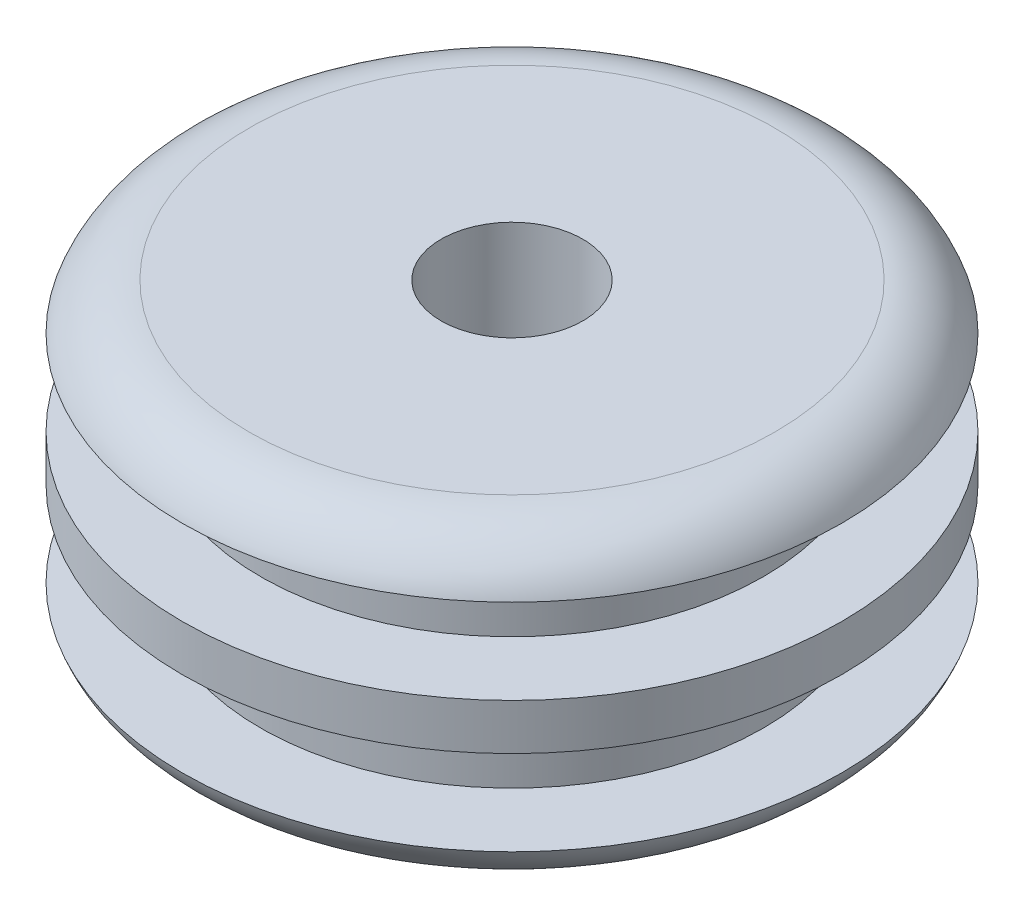
ISO-10303-21;
HEADER;
FILE_DESCRIPTION(('STEP AP214'),'2;1');
FILE_NAME('part.step','',(''),(''),'','','');
FILE_SCHEMA(('AUTOMOTIVE_DESIGN { 1 0 10303 214 1 1 1 1 }'));
ENDSEC;
DATA;
#1=APPLICATION_CONTEXT('core data for automotive mechanical design processes');
#2=APPLICATION_PROTOCOL_DEFINITION('international standard','automotive_design',2000,#1);
#3=PRODUCT_CONTEXT('',#1,'mechanical');
#4=PRODUCT('Part','Part','',(#3));
#5=PRODUCT_RELATED_PRODUCT_CATEGORY('part','',(#4));
#6=PRODUCT_DEFINITION_FORMATION('','',#4);
#7=PRODUCT_DEFINITION_CONTEXT('part definition',#1,'design');
#8=PRODUCT_DEFINITION('design','',#6,#7);
#9=PRODUCT_DEFINITION_SHAPE('','',#8);
#10=(LENGTH_UNIT() NAMED_UNIT(*) SI_UNIT(.MILLI.,.METRE.));
#11=(NAMED_UNIT(*) PLANE_ANGLE_UNIT() SI_UNIT($,.RADIAN.));
#12=(NAMED_UNIT(*) SI_UNIT($,.STERADIAN.) SOLID_ANGLE_UNIT());
#13=UNCERTAINTY_MEASURE_WITH_UNIT(LENGTH_MEASURE(1.E-05),#10,'distance_accuracy_value','');
#14=(GEOMETRIC_REPRESENTATION_CONTEXT(3) GLOBAL_UNCERTAINTY_ASSIGNED_CONTEXT((#13)) GLOBAL_UNIT_ASSIGNED_CONTEXT((#10,
#11,#12)) REPRESENTATION_CONTEXT('',''));
#15=CARTESIAN_POINT('',(0.,0.,0.));
#16=DIRECTION('',(0.,0.,1.));
#17=DIRECTION('',(1.,0.,0.));
#18=AXIS2_PLACEMENT_3D('',#15,#16,#17);
#19=CARTESIAN_POINT('',(0.,-1.85,0.));
#20=DIRECTION('',(0.,-1.,0.));
#21=DIRECTION('',(0.,0.,-1.));
#22=AXIS2_PLACEMENT_3D('',#19,#20,#21);
#23=PLANE('',#22);
#24=CARTESIAN_POINT('',(0.,-1.85,0.));
#25=DIRECTION('',(0.,-1.,0.));
#26=DIRECTION('',(0.,0.,-1.));
#27=AXIS2_PLACEMENT_3D('',#24,#25,#26);
#28=CIRCLE('',#27,1.);
#29=CARTESIAN_POINT('',(0.,-1.85,-1.));
#30=VERTEX_POINT('',#29);
#31=EDGE_CURVE('E152',#30,#30,#28,.T.);
#32=ORIENTED_EDGE('',*,*,#31,.F.);
#33=EDGE_LOOP('',(#32));
#34=FACE_BOUND('',#33,.T.);
#35=CARTESIAN_POINT('',(0.,-1.85,0.));
#36=DIRECTION('',(0.,-1.,0.));
#37=DIRECTION('',(0.,0.,-1.));
#38=AXIS2_PLACEMENT_3D('',#35,#36,#37);
#39=CIRCLE('',#38,1.85);
#40=CARTESIAN_POINT('',(0.,-1.85,-1.85));
#41=VERTEX_POINT('',#40);
#42=EDGE_CURVE('E180',#41,#41,#39,.T.);
#43=ORIENTED_EDGE('',*,*,#42,.T.);
#44=EDGE_LOOP('',(#43));
#45=FACE_BOUND('',#44,.T.);
#46=ADVANCED_FACE('F37',(#34,#45),#23,.T.);
#47=CARTESIAN_POINT('',(0.,2.5,0.));
#48=DIRECTION('',(0.,1.,0.));
#49=DIRECTION('',(0.,0.,1.));
#50=AXIS2_PLACEMENT_3D('',#47,#48,#49);
#51=PLANE('',#50);
#52=CARTESIAN_POINT('',(0.,2.5,0.));
#53=DIRECTION('',(0.,1.,0.));
#54=DIRECTION('',(0.,0.,1.));
#55=AXIS2_PLACEMENT_3D('',#52,#53,#54);
#56=CIRCLE('',#55,3.71325030024024);
#57=CARTESIAN_POINT('',(0.,2.5,3.71325030024024));
#58=VERTEX_POINT('',#57);
#59=EDGE_CURVE('E11',#58,#58,#56,.T.);
#60=ORIENTED_EDGE('',*,*,#59,.T.);
#61=EDGE_LOOP('',(#60));
#62=FACE_BOUND('',#61,.T.);
#63=CARTESIAN_POINT('',(0.,2.5,0.));
#64=DIRECTION('',(0.,1.,0.));
#65=DIRECTION('',(0.,0.,1.));
#66=AXIS2_PLACEMENT_3D('',#63,#64,#65);
#67=CIRCLE('',#66,1.);
#68=CARTESIAN_POINT('',(0.,2.5,1.));
#69=VERTEX_POINT('',#68);
#70=EDGE_CURVE('E56',#69,#69,#67,.T.);
#71=ORIENTED_EDGE('',*,*,#70,.F.);
#72=EDGE_LOOP('',(#71));
#73=FACE_BOUND('',#72,.T.);
#74=ADVANCED_FACE('F132',(#62,#73),#51,.T.);
#75=CARTESIAN_POINT('',(0.,0.,0.));
#76=DIRECTION('',(0.,1.,0.));
#77=DIRECTION('',(0.,0.,1.));
#78=AXIS2_PLACEMENT_3D('',#75,#76,#77);
#79=CYLINDRICAL_SURFACE('',#78,1.);
#80=ORIENTED_EDGE('',*,*,#70,.T.);
#81=EDGE_LOOP('',(#80));
#82=FACE_BOUND('',#81,.T.);
#83=ORIENTED_EDGE('',*,*,#31,.T.);
#84=EDGE_LOOP('',(#83));
#85=FACE_BOUND('',#84,.T.);
#86=ADVANCED_FACE('F128',(#82,#85),#79,.F.);
#87=CARTESIAN_POINT('',(-5.75,0.,0.));
#88=DIRECTION('',(0.,-1.,0.));
#89=DIRECTION('',(1.,0.,0.));
#90=AXIS2_PLACEMENT_3D('',#87,#88,#89);
#91=PLANE('',#90);
#92=CARTESIAN_POINT('',(0.,0.,0.));
#93=DIRECTION('',(0.,-1.,0.));
#94=DIRECTION('',(1.,0.,0.));
#95=AXIS2_PLACEMENT_3D('',#92,#93,#94);
#96=CIRCLE('',#95,3.55);
#97=CARTESIAN_POINT('',(3.55,0.,0.));
#98=VERTEX_POINT('',#97);
#99=EDGE_CURVE('E169',#98,#98,#96,.T.);
#100=ORIENTED_EDGE('',*,*,#99,.F.);
#101=EDGE_LOOP('',(#100));
#102=FACE_BOUND('',#101,.T.);
#103=CARTESIAN_POINT('',(0.,0.,0.));
#104=DIRECTION('',(0.,-1.,0.));
#105=DIRECTION('',(1.,0.,0.));
#106=AXIS2_PLACEMENT_3D('',#103,#104,#105);
#107=CIRCLE('',#106,4.65);
#108=CARTESIAN_POINT('',(4.65,0.,0.));
#109=VERTEX_POINT('',#108);
#110=EDGE_CURVE('E157',#109,#109,#107,.T.);
#111=ORIENTED_EDGE('',*,*,#110,.T.);
#112=EDGE_LOOP('',(#111));
#113=FACE_BOUND('',#112,.T.);
#114=ADVANCED_FACE('F121',(#102,#113),#91,.T.);
#115=CARTESIAN_POINT('',(-5.75,-1.2,0.));
#116=DIRECTION('',(0.,1.,0.));
#117=DIRECTION('',(-1.,0.,0.));
#118=AXIS2_PLACEMENT_3D('',#115,#116,#117);
#119=PLANE('',#118);
#120=CARTESIAN_POINT('',(0.,-1.2,0.));
#121=DIRECTION('',(0.,-1.,0.));
#122=DIRECTION('',(1.,0.,0.));
#123=AXIS2_PLACEMENT_3D('',#120,#121,#122);
#124=CIRCLE('',#123,3.55);
#125=CARTESIAN_POINT('',(3.55,-1.2,0.));
#126=VERTEX_POINT('',#125);
#127=EDGE_CURVE('E173',#126,#126,#124,.T.);
#128=ORIENTED_EDGE('',*,*,#127,.T.);
#129=EDGE_LOOP('',(#128));
#130=FACE_BOUND('',#129,.T.);
#131=CARTESIAN_POINT('',(0.,-1.2,0.));
#132=DIRECTION('',(0.,1.,0.));
#133=DIRECTION('',(-1.,0.,0.));
#134=AXIS2_PLACEMENT_3D('',#131,#132,#133);
#135=CIRCLE('',#134,4.65);
#136=CARTESIAN_POINT('',(-4.65,-1.2,0.));
#137=VERTEX_POINT('',#136);
#138=EDGE_CURVE('E161',#137,#137,#135,.T.);
#139=ORIENTED_EDGE('',*,*,#138,.T.);
#140=EDGE_LOOP('',(#139));
#141=FACE_BOUND('',#140,.T.);
#142=ADVANCED_FACE('F117',(#130,#141),#119,.T.);
#143=CARTESIAN_POINT('',(0.,0.,0.));
#144=DIRECTION('',(0.,-1.,0.));
#145=DIRECTION('',(1.,0.,0.));
#146=AXIS2_PLACEMENT_3D('',#143,#144,#145);
#147=CYLINDRICAL_SURFACE('',#146,3.55);
#148=ORIENTED_EDGE('',*,*,#99,.T.);
#149=EDGE_LOOP('',(#148));
#150=FACE_BOUND('',#149,.T.);
#151=ORIENTED_EDGE('',*,*,#127,.F.);
#152=EDGE_LOOP('',(#151));
#153=FACE_BOUND('',#152,.T.);
#154=ADVANCED_FACE('F120',(#150,#153),#147,.T.);
#155=CARTESIAN_POINT('',(0.,2.5,0.));
#156=DIRECTION('',(0.,-1.,0.));
#157=DIRECTION('',(0.,0.,-1.));
#158=AXIS2_PLACEMENT_3D('',#155,#156,#157);
#159=CYLINDRICAL_SURFACE('',#158,4.65);
#160=ORIENTED_EDGE('',*,*,#110,.F.);
#161=EDGE_LOOP('',(#160));
#162=FACE_BOUND('',#161,.T.);
#163=CARTESIAN_POINT('',(0.,0.65,0.));
#164=DIRECTION('',(0.,1.,0.));
#165=DIRECTION('',(-1.,0.,0.));
#166=AXIS2_PLACEMENT_3D('',#163,#164,#165);
#167=CIRCLE('',#166,4.65);
#168=CARTESIAN_POINT('',(-4.65,0.649999999999999,0.));
#169=VERTEX_POINT('',#168);
#170=EDGE_CURVE('E153',#169,#169,#167,.T.);
#171=ORIENTED_EDGE('',*,*,#170,.F.);
#172=EDGE_LOOP('',(#171));
#173=FACE_BOUND('',#172,.T.);
#174=ADVANCED_FACE('F111',(#162,#173),#159,.T.);
#175=CARTESIAN_POINT('',(-5.75,1.85,0.));
#176=DIRECTION('',(0.,-1.,0.));
#177=DIRECTION('',(1.,0.,0.));
#178=AXIS2_PLACEMENT_3D('',#175,#176,#177);
#179=PLANE('',#178);
#180=CARTESIAN_POINT('',(0.,1.85,0.));
#181=DIRECTION('',(0.,-1.,0.));
#182=DIRECTION('',(1.,0.,0.));
#183=AXIS2_PLACEMENT_3D('',#180,#181,#182);
#184=CIRCLE('',#183,3.55);
#185=CARTESIAN_POINT('',(3.55,1.85,0.));
#186=VERTEX_POINT('',#185);
#187=EDGE_CURVE('E166',#186,#186,#184,.T.);
#188=ORIENTED_EDGE('',*,*,#187,.F.);
#189=EDGE_LOOP('',(#188));
#190=FACE_BOUND('',#189,.T.);
#191=CARTESIAN_POINT('',(0.,1.85,0.));
#192=DIRECTION('',(0.,-1.,0.));
#193=DIRECTION('',(1.,0.,0.));
#194=AXIS2_PLACEMENT_3D('',#191,#192,#193);
#195=CIRCLE('',#194,4.65);
#196=CARTESIAN_POINT('',(4.65,1.85,0.));
#197=VERTEX_POINT('',#196);
#198=EDGE_CURVE('E59',#197,#197,#195,.T.);
#199=ORIENTED_EDGE('',*,*,#198,.T.);
#200=EDGE_LOOP('',(#199));
#201=FACE_BOUND('',#200,.T.);
#202=ADVANCED_FACE('F107',(#190,#201),#179,.T.);
#203=CARTESIAN_POINT('',(-5.75,0.649999999999999,0.));
#204=DIRECTION('',(0.,1.,0.));
#205=DIRECTION('',(-1.,0.,0.));
#206=AXIS2_PLACEMENT_3D('',#203,#204,#205);
#207=PLANE('',#206);
#208=CARTESIAN_POINT('',(0.,0.65,0.));
#209=DIRECTION('',(0.,-1.,0.));
#210=DIRECTION('',(1.,0.,0.));
#211=AXIS2_PLACEMENT_3D('',#208,#209,#210);
#212=CIRCLE('',#211,3.55);
#213=CARTESIAN_POINT('',(3.55,0.65,0.));
#214=VERTEX_POINT('',#213);
#215=EDGE_CURVE('E172',#214,#214,#212,.T.);
#216=ORIENTED_EDGE('',*,*,#215,.T.);
#217=EDGE_LOOP('',(#216));
#218=FACE_BOUND('',#217,.T.);
#219=ORIENTED_EDGE('',*,*,#170,.T.);
#220=EDGE_LOOP('',(#219));
#221=FACE_BOUND('',#220,.T.);
#222=ADVANCED_FACE('F103',(#218,#221),#207,.T.);
#223=CARTESIAN_POINT('',(0.,0.,0.));
#224=DIRECTION('',(0.,-1.,0.));
#225=DIRECTION('',(1.,0.,0.));
#226=AXIS2_PLACEMENT_3D('',#223,#224,#225);
#227=CYLINDRICAL_SURFACE('',#226,3.55);
#228=ORIENTED_EDGE('',*,*,#187,.T.);
#229=EDGE_LOOP('',(#228));
#230=FACE_BOUND('',#229,.T.);
#231=ORIENTED_EDGE('',*,*,#215,.F.);
#232=EDGE_LOOP('',(#231));
#233=FACE_BOUND('',#232,.T.);
#234=ADVANCED_FACE('F106',(#230,#233),#227,.T.);
#235=CARTESIAN_POINT('',(0.,-0.85,0.));
#236=DIRECTION('',(0.,1.,0.));
#237=DIRECTION('',(0.,0.,1.));
#238=AXIS2_PLACEMENT_3D('',#235,#236,#237);
#239=TOROIDAL_SURFACE('',#238,3.71325030024024,1.);
#240=ORIENTED_EDGE('',*,*,#138,.F.);
#241=EDGE_LOOP('',(#240));
#242=FACE_BOUND('',#241,.T.);
#243=CARTESIAN_POINT('',(0.,-1.8499999999999,-3.71325030024043));
#244=CARTESIAN_POINT('',(0.486063325662838,-1.8499999999999,-3.71325030024043));
#245=CARTESIAN_POINT('',(0.971935412042218,-1.85000000000017,-3.61660433329472));
#246=CARTESIAN_POINT('',(1.8700633282112,-1.84999999999963,-3.24458756967233));
#247=CARTESIAN_POINT('',(2.28196579388092,-1.84999999999981,-2.96936314120542));
#248=CARTESIAN_POINT('',(2.96936314120506,-1.84999999999999,-2.28196579388056));
#249=CARTESIAN_POINT('',(3.24458756967237,-1.84999999999981,-1.87006332821124));
#250=CARTESIAN_POINT('',(3.61660433329467,-1.84999999999999,-0.97193541204217));
#251=CARTESIAN_POINT('',(3.71325030024043,-1.8499999999999,-0.486063325662939));
#252=CARTESIAN_POINT('',(3.71325030024043,-1.8499999999999,0.486063325662938));
#253=CARTESIAN_POINT('',(3.61660433329503,-1.85000000000008,0.971935412042263));
#254=CARTESIAN_POINT('',(3.24458756967201,-1.84999999999972,1.87006332821115));
#255=CARTESIAN_POINT('',(2.96936314120499,-1.8499999999999,2.28196579388063));
#256=CARTESIAN_POINT('',(2.28196579388098,-1.8499999999999,2.96936314120536));
#257=CARTESIAN_POINT('',(1.87006332821097,-1.8499999999999,3.24458756967209));
#258=CARTESIAN_POINT('',(0.971935412042449,-1.8499999999999,3.61660433329495));
#259=CARTESIAN_POINT('',(0.486063325662939,-1.8499999999999,3.71325030024043));
#260=CARTESIAN_POINT('',(-0.486063325662938,-1.8499999999999,3.71325030024043));
#261=CARTESIAN_POINT('',(-0.971935412042169,-1.85000000000026,3.61660433329459));
#262=CARTESIAN_POINT('',(-1.87006332821124,-1.84999999999954,3.24458756967246));
#263=CARTESIAN_POINT('',(-2.28196579388081,-1.84999999999999,2.96936314120517));
#264=CARTESIAN_POINT('',(-2.96936314120518,-1.84999999999981,2.2819657938808));
#265=CARTESIAN_POINT('',(-3.24458756967193,-1.84999999999999,1.87006332821107));
#266=CARTESIAN_POINT('',(-3.61660433329511,-1.84999999999981,0.971935412042354));
#267=CARTESIAN_POINT('',(-3.71325030024043,-1.8499999999999,0.486063325662933));
#268=CARTESIAN_POINT('',(-3.71325030024043,-1.8499999999999,-0.486063325662945));
#269=CARTESIAN_POINT('',(-3.61660433329475,-1.85000000000035,-0.971935412042163));
#270=CARTESIAN_POINT('',(-3.24458756967229,-1.84999999999945,-1.87006332821124));
#271=CARTESIAN_POINT('',(-2.96936314120543,-1.8499999999999,-2.28196579388091));
#272=CARTESIAN_POINT('',(-2.28196579388056,-1.8499999999999,-2.96936314120506));
#273=CARTESIAN_POINT('',(-1.87006332821107,-1.84999999999981,-3.24458756967211));
#274=CARTESIAN_POINT('',(-0.971935412042354,-1.84999999999999,-3.61660433329493));
#275=CARTESIAN_POINT('',(-0.486063325662839,-1.8499999999999,-3.71325030024043));
#276=CARTESIAN_POINT('',(0.,-1.8499999999999,-3.71325030024043));
#277=(BOUNDED_CURVE() B_SPLINE_CURVE(3,(#243,#244,#245,#246,#247,#248,#249,#250,#251,#252,#253,
#254,#255,#256,#257,#258,#259,#260,#261,#262,#263,#264,#265,#266,#267,#268,#269,#270,#271,#272,
#273,#274,#275,#276),.UNSPECIFIED.,.T.,.F.) B_SPLINE_CURVE_WITH_KNOTS((4,2,2,2,2,2,2,2,2,2,2,2,
2,2,2,2,4),(0.,0.392699081698724,0.785398163397448,1.17809724509617,1.5707963267949,
1.96349540849362,2.35619449019234,2.74889357189107,3.14159265358979,3.53429173528852,
3.92699081698724,4.31968989868597,4.71238898038469,5.10508806208341,5.49778714378214,
5.89048622548086,6.28318530717959),
.UNSPECIFIED.) CURVE() GEOMETRIC_REPRESENTATION_ITEM() RATIONAL_B_SPLINE_CURVE((1.,1.,1.,1.,1.,
1.,1.,1.,1.,1.,1.,1.,1.,1.,1.,1.,1.,1.,1.,1.,1.,1.,1.,1.,1.,1.,1.,1.,1.,1.,1.,1.,1.,1.)) REPRESENTATION_ITEM(''));
#278=CARTESIAN_POINT('',(0.,-1.8499999999999,-3.71325030024043));
#279=VERTEX_POINT('',#278);
#280=EDGE_CURVE('E51',#279,#279,#277,.T.);
#281=ORIENTED_EDGE('',*,*,#280,.F.);
#282=EDGE_LOOP('',(#281));
#283=FACE_BOUND('',#282,.T.);
#284=ADVANCED_FACE('F115',(#242,#283),#239,.T.);
#285=CARTESIAN_POINT('',(0.,1.5,0.));
#286=DIRECTION('',(0.,-1.,0.));
#287=DIRECTION('',(0.,0.,-1.));
#288=AXIS2_PLACEMENT_3D('',#285,#286,#287);
#289=TOROIDAL_SURFACE('',#288,3.71325030024024,1.);
#290=ORIENTED_EDGE('',*,*,#198,.F.);
#291=EDGE_LOOP('',(#290));
#292=FACE_BOUND('',#291,.T.);
#293=ORIENTED_EDGE('',*,*,#59,.F.);
#294=EDGE_LOOP('',(#293));
#295=FACE_BOUND('',#294,.T.);
#296=ADVANCED_FACE('F101',(#292,#295),#289,.T.);
#297=CARTESIAN_POINT('',(0.,-0.55,0.));
#298=DIRECTION('',(0.,-1.,0.));
#299=DIRECTION('',(0.,0.,-1.));
#300=AXIS2_PLACEMENT_3D('',#297,#298,#299);
#301=PLANE('',#300);
#302=CARTESIAN_POINT('',(0.,-0.55,0.));
#303=DIRECTION('',(0.,-1.,0.));
#304=DIRECTION('',(0.,0.,-1.));
#305=AXIS2_PLACEMENT_3D('',#302,#303,#304);
#306=CIRCLE('',#305,1.85);
#307=CARTESIAN_POINT('',(0.,-0.55,-1.85));
#308=VERTEX_POINT('',#307);
#309=EDGE_CURVE('E183',#308,#308,#306,.T.);
#310=ORIENTED_EDGE('',*,*,#309,.F.);
#311=EDGE_LOOP('',(#310));
#312=FACE_BOUND('',#311,.T.);
#313=CARTESIAN_POINT('',(0.,-0.549999999999987,-3.35000000000028));
#314=CARTESIAN_POINT('',(-0.438513972749215,-0.549999999999987,-3.35000000000028));
#315=CARTESIAN_POINT('',(-0.876855414279712,-0.549999999999987,-3.26280846614489));
#316=CARTESIAN_POINT('',(-1.68712358256661,-0.549999999999987,-2.92718440168124));
#317=CARTESIAN_POINT('',(-2.05873151319928,-0.549999999999942,-2.67888392075116));
#318=CARTESIAN_POINT('',(-2.67888392075099,-0.550000000000032,-2.05873151319909));
#319=CARTESIAN_POINT('',(-2.92718440168178,-0.549999999999942,-1.68712358256669));
#320=CARTESIAN_POINT('',(-3.26280846614436,-0.550000000000032,-0.876855414279613));
#321=CARTESIAN_POINT('',(-3.35000000000028,-0.549999999999987,-0.438513972749311));
#322=CARTESIAN_POINT('',(-3.35000000000028,-0.549999999999987,0.4385139727493));
#323=CARTESIAN_POINT('',(-3.26280846614525,-0.549999999999987,0.876855414279893));
#324=CARTESIAN_POINT('',(-2.92718440168088,-0.549999999999987,1.68712358256643));
#325=CARTESIAN_POINT('',(-2.67888392075119,-0.549999999999987,2.05873151319907));
#326=CARTESIAN_POINT('',(-2.05873151319907,-0.549999999999987,2.67888392075119));
#327=CARTESIAN_POINT('',(-1.68712358256672,-0.549999999999942,2.92718440168154));
#328=CARTESIAN_POINT('',(-0.876855414279585,-0.550000000000032,3.2628084661446));
#329=CARTESIAN_POINT('',(-0.438513972749305,-0.549999999999987,3.35000000000028));
#330=CARTESIAN_POINT('',(0.438513972749305,-0.549999999999987,3.35000000000028));
#331=CARTESIAN_POINT('',(0.876855414279954,-0.549999999999987,3.26280846614496));
#332=CARTESIAN_POINT('',(1.68712358256637,-0.549999999999987,2.92718440168117));
#333=CARTESIAN_POINT('',(2.05873151319907,-0.549999999999988,2.67888392075119));
#334=CARTESIAN_POINT('',(2.67888392075119,-0.549999999999988,2.05873151319907));
#335=CARTESIAN_POINT('',(2.92718440168112,-0.550000000000032,1.68712358256631));
#336=CARTESIAN_POINT('',(3.26280846614502,-0.549999999999942,0.87685541428001));
#337=CARTESIAN_POINT('',(3.35000000000028,-0.549999999999987,0.438513972749305));
#338=CARTESIAN_POINT('',(3.35000000000028,-0.549999999999987,-0.438513972749305));
#339=CARTESIAN_POINT('',(3.26280846614484,-0.549999999999987,-0.876855414279918));
#340=CARTESIAN_POINT('',(2.9271844016813,-0.549999999999987,-1.68712358256639));
#341=CARTESIAN_POINT('',(2.67888392075105,-0.549999999999987,-2.05873151319939));
#342=CARTESIAN_POINT('',(2.05873151319921,-0.549999999999987,-2.67888392075087));
#343=CARTESIAN_POINT('',(1.68712358256647,-0.549999999999987,-2.9271844016816));
#344=CARTESIAN_POINT('',(0.876855414279845,-0.549999999999987,-3.26280846614454));
#345=CARTESIAN_POINT('',(0.438513972749214,-0.549999999999987,-3.35000000000028));
#346=CARTESIAN_POINT('',(0.,-0.549999999999987,-3.35000000000028));
#347=(BOUNDED_CURVE() B_SPLINE_CURVE(3,(#313,#314,#315,#316,#317,#318,#319,#320,#321,#322,#323,
#324,#325,#326,#327,#328,#329,#330,#331,#332,#333,#334,#335,#336,#337,#338,#339,#340,#341,#342,
#343,#344,#345,#346),.UNSPECIFIED.,.T.,.F.) B_SPLINE_CURVE_WITH_KNOTS((4,2,2,2,2,2,2,2,2,2,2,2,
2,2,2,2,4),(0.,0.392699081698725,0.785398163397448,1.17809724509617,1.5707963267949,
1.96349540849362,2.35619449019234,2.74889357189107,3.14159265358979,3.53429173528852,
3.92699081698724,4.31968989868597,4.71238898038469,5.10508806208341,5.49778714378214,
5.89048622548086,6.28318530717959),
.UNSPECIFIED.) CURVE() GEOMETRIC_REPRESENTATION_ITEM() RATIONAL_B_SPLINE_CURVE((1.,1.,1.,1.,1.,
1.,1.,1.,1.,1.,1.,1.,1.,1.,1.,1.,1.,1.,1.,1.,1.,1.,1.,1.,1.,1.,1.,1.,1.,1.,1.,1.,1.,1.)) REPRESENTATION_ITEM(''));
#348=CARTESIAN_POINT('',(0.,-0.549999999999987,-3.35000000000028));
#349=VERTEX_POINT('',#348);
#350=EDGE_CURVE('E65',#349,#349,#347,.F.);
#351=ORIENTED_EDGE('',*,*,#350,.T.);
#352=EDGE_LOOP('',(#351));
#353=FACE_BOUND('',#352,.T.);
#354=ADVANCED_FACE('F90',(#312,#353),#301,.T.);
#355=CARTESIAN_POINT('',(0.,-0.55,0.));
#356=DIRECTION('',(0.,-1.,0.));
#357=DIRECTION('',(0.,0.,-1.));
#358=AXIS2_PLACEMENT_3D('',#355,#356,#357);
#359=CYLINDRICAL_SURFACE('',#358,1.85);
#360=ORIENTED_EDGE('',*,*,#309,.T.);
#361=EDGE_LOOP('',(#360));
#362=FACE_BOUND('',#361,.T.);
#363=ORIENTED_EDGE('',*,*,#42,.F.);
#364=EDGE_LOOP('',(#363));
#365=FACE_BOUND('',#364,.T.);
#366=ADVANCED_FACE('F100',(#362,#365),#359,.T.);
#367=CARTESIAN_POINT('',(0.,-0.549999999999987,-3.35000000000028));
#368=CARTESIAN_POINT('',(0.438513972749214,-0.549999999999987,-3.35000000000028));
#369=CARTESIAN_POINT('',(0.876855414279845,-0.549999999999987,-3.26280846614454));
#370=CARTESIAN_POINT('',(1.68712358256647,-0.549999999999987,-2.9271844016816));
#371=CARTESIAN_POINT('',(2.05873151319921,-0.549999999999987,-2.67888392075087));
#372=CARTESIAN_POINT('',(2.67888392075105,-0.549999999999987,-2.05873151319939));
#373=CARTESIAN_POINT('',(2.9271844016813,-0.549999999999987,-1.68712358256639));
#374=CARTESIAN_POINT('',(3.26280846614484,-0.549999999999987,-0.876855414279918));
#375=CARTESIAN_POINT('',(3.35000000000028,-0.549999999999987,-0.438513972749305));
#376=CARTESIAN_POINT('',(3.35000000000028,-0.549999999999987,0.438513972749305));
#377=CARTESIAN_POINT('',(3.26280846614502,-0.549999999999942,0.87685541428001));
#378=CARTESIAN_POINT('',(2.92718440168112,-0.550000000000032,1.68712358256631));
#379=CARTESIAN_POINT('',(2.67888392075119,-0.549999999999988,2.05873151319907));
#380=CARTESIAN_POINT('',(2.05873151319907,-0.549999999999988,2.67888392075119));
#381=CARTESIAN_POINT('',(1.68712358256637,-0.549999999999987,2.92718440168117));
#382=CARTESIAN_POINT('',(0.876855414279954,-0.549999999999987,3.26280846614496));
#383=CARTESIAN_POINT('',(0.438513972749305,-0.549999999999987,3.35000000000028));
#384=CARTESIAN_POINT('',(-0.438513972749305,-0.549999999999987,3.35000000000028));
#385=CARTESIAN_POINT('',(-0.876855414279585,-0.550000000000032,3.2628084661446));
#386=CARTESIAN_POINT('',(-1.68712358256672,-0.549999999999942,2.92718440168154));
#387=CARTESIAN_POINT('',(-2.05873151319907,-0.549999999999987,2.67888392075119));
#388=CARTESIAN_POINT('',(-2.67888392075119,-0.549999999999987,2.05873151319907));
#389=CARTESIAN_POINT('',(-2.92718440168088,-0.549999999999987,1.68712358256643));
#390=CARTESIAN_POINT('',(-3.26280846614525,-0.549999999999987,0.876855414279893));
#391=CARTESIAN_POINT('',(-3.35000000000028,-0.549999999999987,0.4385139727493));
#392=CARTESIAN_POINT('',(-3.35000000000028,-0.549999999999987,-0.438513972749311));
#393=CARTESIAN_POINT('',(-3.26280846614436,-0.550000000000032,-0.876855414279613));
#394=CARTESIAN_POINT('',(-2.92718440168178,-0.549999999999942,-1.68712358256669));
#395=CARTESIAN_POINT('',(-2.67888392075099,-0.550000000000032,-2.05873151319909));
#396=CARTESIAN_POINT('',(-2.05873151319928,-0.549999999999942,-2.67888392075116));
#397=CARTESIAN_POINT('',(-1.68712358256661,-0.549999999999987,-2.92718440168124));
#398=CARTESIAN_POINT('',(-0.876855414279712,-0.549999999999987,-3.26280846614489));
#399=CARTESIAN_POINT('',(-0.438513972749215,-0.549999999999987,-3.35000000000028));
#400=CARTESIAN_POINT('',(0.,-0.549999999999987,-3.35000000000028));
#401=CARTESIAN_POINT('',(0.,-1.24193442294093,-3.38155025744376));
#402=CARTESIAN_POINT('',(0.442643891773931,-1.24193442294093,-3.38155025744376));
#403=CARTESIAN_POINT('',(0.885113627432368,-1.24193442294156,-3.29353755482974));
#404=CARTESIAN_POINT('',(1.70301289103489,-1.2419344229403,-2.95475258719138));
#405=CARTESIAN_POINT('',(2.0781206204375,-1.24193442294057,-2.7041136154857));
#406=CARTESIAN_POINT('',(2.7041136154857,-1.24193442294129,-2.0781206204375));
#407=CARTESIAN_POINT('',(2.95475258719145,-1.24193442294093,-1.703012891035));
#408=CARTESIAN_POINT('',(3.29353755482968,-1.24193442294093,-0.885113627432259));
#409=CARTESIAN_POINT('',(3.38155025744376,-1.24193442294093,-0.442643891774023));
#410=CARTESIAN_POINT('',(3.38155025744376,-1.24193442294093,0.442643891774022));
#411=CARTESIAN_POINT('',(3.29353755483058,-1.24193442294174,0.885113627432532));
#412=CARTESIAN_POINT('',(2.95475258719054,-1.24193442294012,1.70301289103473));
#413=CARTESIAN_POINT('',(2.70411361548601,-1.24193442294075,2.07812062043791));
#414=CARTESIAN_POINT('',(2.07812062043718,-1.24193442294111,2.7041136154853));
#415=CARTESIAN_POINT('',(1.70301289103515,-1.24193442294057,2.95475258719168));
#416=CARTESIAN_POINT('',(0.88511362743212,-1.24193442294129,3.29353755482944));
#417=CARTESIAN_POINT('',(0.442643891774023,-1.24193442294093,3.38155025744376));
#418=CARTESIAN_POINT('',(-0.442643891774022,-1.24193442294093,3.38155025744376));
#419=CARTESIAN_POINT('',(-0.885113627431931,-1.24193442294165,3.29353755482926));
#420=CARTESIAN_POINT('',(-1.70301289103532,-1.24193442294021,2.95475258719186));
#421=CARTESIAN_POINT('',(-2.07812062043682,-1.24193442294075,2.70411361548529));
#422=CARTESIAN_POINT('',(-2.70411361548638,-1.24193442294111,2.0781206204379));
#423=CARTESIAN_POINT('',(-2.95475258719048,-1.24193442294084,1.70301289103468));
#424=CARTESIAN_POINT('',(-3.29353755483064,-1.24193442294102,0.885113627432589));
#425=CARTESIAN_POINT('',(-3.38155025744376,-1.24193442294093,0.442643891774018));
#426=CARTESIAN_POINT('',(-3.38155025744376,-1.24193442294093,-0.442643891774028));
#427=CARTESIAN_POINT('',(-3.29353755482956,-1.24193442294093,-0.885113627432039));
#428=CARTESIAN_POINT('',(-2.95475258719157,-1.24193442294093,-1.70301289103521));
#429=CARTESIAN_POINT('',(-2.70411361548546,-1.24193442294012,-2.07812062043719));
#430=CARTESIAN_POINT('',(-2.07812062043775,-1.24193442294174,-2.70411361548599));
#431=CARTESIAN_POINT('',(-1.70301289103486,-1.24193442294084,-2.9547525871912));
#432=CARTESIAN_POINT('',(-0.885113627432409,-1.24193442294102,-3.29353755482992));
#433=CARTESIAN_POINT('',(-0.442643891773931,-1.24193442294093,-3.38155025744376));
#434=CARTESIAN_POINT('',(0.,-1.24193442294093,-3.38155025744376));
#435=CARTESIAN_POINT('',(0.,-1.8499999999999,-3.71325030024043));
#436=CARTESIAN_POINT('',(0.486063325662838,-1.8499999999999,-3.71325030024043));
#437=CARTESIAN_POINT('',(0.971935412042218,-1.85000000000017,-3.61660433329472));
#438=CARTESIAN_POINT('',(1.8700633282112,-1.84999999999963,-3.24458756967233));
#439=CARTESIAN_POINT('',(2.28196579388092,-1.84999999999981,-2.96936314120542));
#440=CARTESIAN_POINT('',(2.96936314120506,-1.84999999999999,-2.28196579388056));
#441=CARTESIAN_POINT('',(3.24458756967237,-1.84999999999981,-1.87006332821124));
#442=CARTESIAN_POINT('',(3.61660433329467,-1.84999999999999,-0.97193541204217));
#443=CARTESIAN_POINT('',(3.71325030024043,-1.8499999999999,-0.486063325662939));
#444=CARTESIAN_POINT('',(3.71325030024043,-1.8499999999999,0.486063325662938));
#445=CARTESIAN_POINT('',(3.61660433329503,-1.85000000000008,0.971935412042263));
#446=CARTESIAN_POINT('',(3.24458756967201,-1.84999999999972,1.87006332821115));
#447=CARTESIAN_POINT('',(2.96936314120499,-1.8499999999999,2.28196579388063));
#448=CARTESIAN_POINT('',(2.28196579388098,-1.8499999999999,2.96936314120536));
#449=CARTESIAN_POINT('',(1.87006332821097,-1.8499999999999,3.24458756967209));
#450=CARTESIAN_POINT('',(0.971935412042449,-1.8499999999999,3.61660433329495));
#451=CARTESIAN_POINT('',(0.486063325662939,-1.8499999999999,3.71325030024043));
#452=CARTESIAN_POINT('',(-0.486063325662938,-1.8499999999999,3.71325030024043));
#453=CARTESIAN_POINT('',(-0.971935412042169,-1.85000000000026,3.61660433329459));
#454=CARTESIAN_POINT('',(-1.87006332821124,-1.84999999999954,3.24458756967246));
#455=CARTESIAN_POINT('',(-2.28196579388081,-1.84999999999999,2.96936314120517));
#456=CARTESIAN_POINT('',(-2.96936314120518,-1.84999999999981,2.2819657938808));
#457=CARTESIAN_POINT('',(-3.24458756967193,-1.84999999999999,1.87006332821107));
#458=CARTESIAN_POINT('',(-3.61660433329511,-1.84999999999981,0.971935412042354));
#459=CARTESIAN_POINT('',(-3.71325030024043,-1.8499999999999,0.486063325662933));
#460=CARTESIAN_POINT('',(-3.71325030024043,-1.8499999999999,-0.486063325662945));
#461=CARTESIAN_POINT('',(-3.61660433329475,-1.85000000000035,-0.971935412042163));
#462=CARTESIAN_POINT('',(-3.24458756967229,-1.84999999999945,-1.87006332821124));
#463=CARTESIAN_POINT('',(-2.96936314120543,-1.8499999999999,-2.28196579388091));
#464=CARTESIAN_POINT('',(-2.28196579388056,-1.8499999999999,-2.96936314120506));
#465=CARTESIAN_POINT('',(-1.87006332821107,-1.84999999999981,-3.24458756967211));
#466=CARTESIAN_POINT('',(-0.971935412042354,-1.84999999999999,-3.61660433329493));
#467=CARTESIAN_POINT('',(-0.486063325662839,-1.8499999999999,-3.71325030024043));
#468=CARTESIAN_POINT('',(0.,-1.8499999999999,-3.71325030024043));
#469=(BOUNDED_SURFACE() B_SPLINE_SURFACE(2,3,((#367,#368,#369,#370,#371,#372,#373,#374,#375,
#376,#377,#378,#379,#380,#381,#382,#383,#384,#385,#386,#387,#388,#389,#390,#391,#392,#393,#394,
#395,#396,#397,#398,#399,#400),(#401,#402,#403,#404,#405,#406,#407,#408,#409,#410,#411,#412,
#413,#414,#415,#416,#417,#418,#419,#420,#421,#422,#423,#424,#425,#426,#427,#428,#429,#430,#431,
#432,#433,#434),(#435,#436,#437,#438,#439,#440,#441,#442,#443,#444,#445,#446,#447,#448,#449,
#450,#451,#452,#453,#454,#455,#456,#457,#458,#459,#460,#461,#462,#463,#464,#465,#466,#467,
#468)),.UNSPECIFIED.,.F.,.T.,.F.) B_SPLINE_SURFACE_WITH_KNOTS((3,3),(4,2,2,2,2,2,2,2,2,2,2,2,2,
2,2,2,4),(0.,1.),(0.,0.392699081698724,0.785398163397448,1.17809724509617,1.5707963267949,
1.96349540849362,2.35619449019234,2.74889357189107,3.14159265358979,3.53429173528852,
3.92699081698724,4.31968989868597,4.71238898038469,5.10508806208341,5.49778714378214,
5.89048622548086,6.28318530717959),
.UNSPECIFIED.) GEOMETRIC_REPRESENTATION_ITEM() RATIONAL_B_SPLINE_SURFACE(((1.,1.,1.,1.,1.,1.,1.,
1.,1.,1.,1.,1.,1.,1.,1.,1.,1.,1.,1.,1.,1.,1.,1.,1.,1.,1.,1.,1.,1.,1.,1.,1.,1.,1.),(19.,19.,19.,
19.,19.,19.,19.,19.,19.,19.,19.,19.,18.9999999999999,18.9999999999999,18.9999999999999,
18.9999999999999,19.,19.,19.,19.,19.,19.,19.,19.,19.,19.,19.,19.,18.9999999999999,
18.9999999999999,18.9999999999999,18.9999999999999,19.,19.),(1.,1.,1.,1.,1.,1.,1.,1.,1.,1.,1.,
1.,1.,1.,1.,1.,1.,1.,1.,1.,1.,1.,1.,1.,1.,1.,1.,1.,1.,1.,1.,1.,1.,1.))) REPRESENTATION_ITEM('') SURFACE());
#470=ORIENTED_EDGE('',*,*,#280,.T.);
#471=EDGE_LOOP('',(#470));
#472=FACE_BOUND('',#471,.T.);
#473=ORIENTED_EDGE('',*,*,#350,.F.);
#474=EDGE_LOOP('',(#473));
#475=FACE_BOUND('',#474,.T.);
#476=ADVANCED_FACE('F40',(#472,#475),#469,.T.);
#477=CLOSED_SHELL('',(#46,#74,#86,#114,#142,#154,#174,#202,#222,#234,#284,#296,#354,#366,#476));
#478=MANIFOLD_SOLID_BREP('B2',#477);
#479=ADVANCED_BREP_SHAPE_REPRESENTATION('',(#18,#478),#14);
#480=SHAPE_DEFINITION_REPRESENTATION(#9,#479);
ENDSEC;
END-ISO-10303-21;
